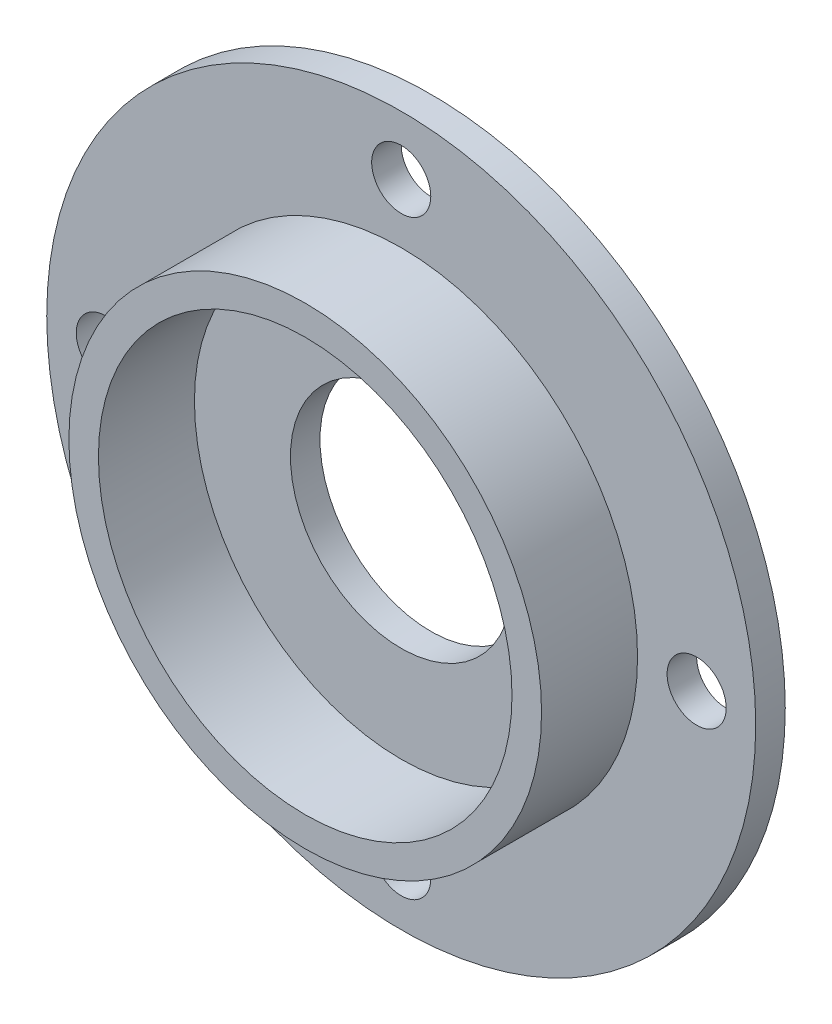
ISO-10303-21;
HEADER;
FILE_DESCRIPTION(('STEP AP214'),'2;1');
FILE_NAME('part.step','',(''),(''),'','','');
FILE_SCHEMA(('AUTOMOTIVE_DESIGN { 1 0 10303 214 1 1 1 1 }'));
ENDSEC;
DATA;
#1=APPLICATION_CONTEXT('core data for automotive mechanical design processes');
#2=APPLICATION_PROTOCOL_DEFINITION('international standard','automotive_design',2000,#1);
#3=PRODUCT_CONTEXT('',#1,'mechanical');
#4=PRODUCT('Part','Part','',(#3));
#5=PRODUCT_RELATED_PRODUCT_CATEGORY('part','',(#4));
#6=PRODUCT_DEFINITION_FORMATION('','',#4);
#7=PRODUCT_DEFINITION_CONTEXT('part definition',#1,'design');
#8=PRODUCT_DEFINITION('design','',#6,#7);
#9=PRODUCT_DEFINITION_SHAPE('','',#8);
#10=(LENGTH_UNIT() NAMED_UNIT(*) SI_UNIT(.MILLI.,.METRE.));
#11=(NAMED_UNIT(*) PLANE_ANGLE_UNIT() SI_UNIT($,.RADIAN.));
#12=(NAMED_UNIT(*) SI_UNIT($,.STERADIAN.) SOLID_ANGLE_UNIT());
#13=UNCERTAINTY_MEASURE_WITH_UNIT(LENGTH_MEASURE(1.E-05),#10,'distance_accuracy_value','');
#14=(GEOMETRIC_REPRESENTATION_CONTEXT(3) GLOBAL_UNCERTAINTY_ASSIGNED_CONTEXT((#13)) GLOBAL_UNIT_ASSIGNED_CONTEXT((#10,
#11,#12)) REPRESENTATION_CONTEXT('',''));
#15=CARTESIAN_POINT('',(0.,0.,0.));
#16=DIRECTION('',(0.,0.,1.));
#17=DIRECTION('',(1.,0.,0.));
#18=AXIS2_PLACEMENT_3D('',#15,#16,#17);
#19=CARTESIAN_POINT('',(0.,0.,10.));
#20=DIRECTION('',(0.,0.,1.));
#21=DIRECTION('',(1.,0.,0.));
#22=AXIS2_PLACEMENT_3D('',#19,#20,#21);
#23=PLANE('',#22);
#24=CARTESIAN_POINT('',(0.,-100.,10.));
#25=DIRECTION('',(0.,0.,1.));
#26=DIRECTION('',(1.,0.,0.));
#27=AXIS2_PLACEMENT_3D('',#24,#25,#26);
#28=CIRCLE('',#27,10.);
#29=CARTESIAN_POINT('',(10.,-100.,10.));
#30=VERTEX_POINT('',#29);
#31=EDGE_CURVE('E65',#30,#30,#28,.T.);
#32=ORIENTED_EDGE('',*,*,#31,.F.);
#33=EDGE_LOOP('',(#32));
#34=FACE_BOUND('',#33,.T.);
#35=CARTESIAN_POINT('',(0.,100.,10.));
#36=DIRECTION('',(0.,0.,1.));
#37=DIRECTION('',(1.,0.,0.));
#38=AXIS2_PLACEMENT_3D('',#35,#36,#37);
#39=CIRCLE('',#38,10.);
#40=CARTESIAN_POINT('',(10.,100.,10.));
#41=VERTEX_POINT('',#40);
#42=EDGE_CURVE('E53',#41,#41,#39,.T.);
#43=ORIENTED_EDGE('',*,*,#42,.F.);
#44=EDGE_LOOP('',(#43));
#45=FACE_BOUND('',#44,.T.);
#46=CARTESIAN_POINT('',(0.,0.,10.));
#47=DIRECTION('',(0.,0.,1.));
#48=DIRECTION('',(1.,0.,0.));
#49=AXIS2_PLACEMENT_3D('',#46,#47,#48);
#50=CIRCLE('',#49,120.);
#51=CARTESIAN_POINT('',(120.,0.,10.));
#52=VERTEX_POINT('',#51);
#53=EDGE_CURVE('E37',#52,#52,#50,.T.);
#54=ORIENTED_EDGE('',*,*,#53,.T.);
#55=EDGE_LOOP('',(#54));
#56=FACE_BOUND('',#55,.T.);
#57=CARTESIAN_POINT('',(100.,0.,10.));
#58=DIRECTION('',(0.,0.,1.));
#59=DIRECTION('',(1.,0.,0.));
#60=AXIS2_PLACEMENT_3D('',#57,#58,#59);
#61=CIRCLE('',#60,10.);
#62=CARTESIAN_POINT('',(110.,0.,10.));
#63=VERTEX_POINT('',#62);
#64=EDGE_CURVE('E59',#63,#63,#61,.T.);
#65=ORIENTED_EDGE('',*,*,#64,.F.);
#66=EDGE_LOOP('',(#65));
#67=FACE_BOUND('',#66,.T.);
#68=CARTESIAN_POINT('',(-100.,0.,10.));
#69=DIRECTION('',(0.,0.,1.));
#70=DIRECTION('',(1.,0.,0.));
#71=AXIS2_PLACEMENT_3D('',#68,#69,#70);
#72=CIRCLE('',#71,9.99999999999999);
#73=CARTESIAN_POINT('',(-90.,0.,10.));
#74=VERTEX_POINT('',#73);
#75=EDGE_CURVE('E71',#74,#74,#72,.T.);
#76=ORIENTED_EDGE('',*,*,#75,.F.);
#77=EDGE_LOOP('',(#76));
#78=FACE_BOUND('',#77,.T.);
#79=CARTESIAN_POINT('',(0.,0.,10.));
#80=DIRECTION('',(0.,0.,1.));
#81=DIRECTION('',(1.,0.,0.));
#82=AXIS2_PLACEMENT_3D('',#79,#80,#81);
#83=CIRCLE('',#82,80.);
#84=CARTESIAN_POINT('',(80.,0.,10.));
#85=VERTEX_POINT('',#84);
#86=EDGE_CURVE('E80',#85,#85,#83,.T.);
#87=ORIENTED_EDGE('',*,*,#86,.F.);
#88=EDGE_LOOP('',(#87));
#89=FACE_BOUND('',#88,.T.);
#90=ADVANCED_FACE('F30',(#34,#45,#56,#67,#78,#89),#23,.T.);
#91=CARTESIAN_POINT('',(0.,0.,10.));
#92=DIRECTION('',(0.,0.,1.));
#93=DIRECTION('',(1.,0.,0.));
#94=AXIS2_PLACEMENT_3D('',#91,#92,#93);
#95=CIRCLE('',#94,70.);
#96=CARTESIAN_POINT('',(70.,0.,10.));
#97=VERTEX_POINT('',#96);
#98=EDGE_CURVE('E10',#97,#97,#95,.F.);
#99=ORIENTED_EDGE('',*,*,#98,.F.);
#100=EDGE_LOOP('',(#99));
#101=FACE_BOUND('',#100,.T.);
#102=CARTESIAN_POINT('',(0.,0.,10.));
#103=DIRECTION('',(0.,0.,1.));
#104=DIRECTION('',(1.,0.,0.));
#105=AXIS2_PLACEMENT_3D('',#102,#103,#104);
#106=CIRCLE('',#105,37.5);
#107=CARTESIAN_POINT('',(37.5,0.,10.));
#108=VERTEX_POINT('',#107);
#109=EDGE_CURVE('E45',#108,#108,#106,.T.);
#110=ORIENTED_EDGE('',*,*,#109,.F.);
#111=EDGE_LOOP('',(#110));
#112=FACE_BOUND('',#111,.T.);
#113=ADVANCED_FACE('F106',(#101,#112),#23,.T.);
#114=CARTESIAN_POINT('',(0.,0.,0.));
#115=DIRECTION('',(0.,0.,1.));
#116=DIRECTION('',(1.,0.,0.));
#117=AXIS2_PLACEMENT_3D('',#114,#115,#116);
#118=PLANE('',#117);
#119=CARTESIAN_POINT('',(0.,-100.,0.));
#120=DIRECTION('',(0.,0.,1.));
#121=DIRECTION('',(1.,0.,0.));
#122=AXIS2_PLACEMENT_3D('',#119,#120,#121);
#123=CIRCLE('',#122,10.);
#124=CARTESIAN_POINT('',(10.,-100.,0.));
#125=VERTEX_POINT('',#124);
#126=EDGE_CURVE('E68',#125,#125,#123,.T.);
#127=ORIENTED_EDGE('',*,*,#126,.T.);
#128=EDGE_LOOP('',(#127));
#129=FACE_BOUND('',#128,.T.);
#130=CARTESIAN_POINT('',(0.,100.,0.));
#131=DIRECTION('',(0.,0.,1.));
#132=DIRECTION('',(1.,0.,0.));
#133=AXIS2_PLACEMENT_3D('',#130,#131,#132);
#134=CIRCLE('',#133,10.);
#135=CARTESIAN_POINT('',(10.,100.,0.));
#136=VERTEX_POINT('',#135);
#137=EDGE_CURVE('E56',#136,#136,#134,.T.);
#138=ORIENTED_EDGE('',*,*,#137,.T.);
#139=EDGE_LOOP('',(#138));
#140=FACE_BOUND('',#139,.T.);
#141=CARTESIAN_POINT('',(0.,0.,0.));
#142=DIRECTION('',(0.,0.,1.));
#143=DIRECTION('',(1.,0.,0.));
#144=AXIS2_PLACEMENT_3D('',#141,#142,#143);
#145=CIRCLE('',#144,120.);
#146=CARTESIAN_POINT('',(120.,0.,0.));
#147=VERTEX_POINT('',#146);
#148=EDGE_CURVE('E41',#147,#147,#145,.T.);
#149=ORIENTED_EDGE('',*,*,#148,.F.);
#150=EDGE_LOOP('',(#149));
#151=FACE_BOUND('',#150,.T.);
#152=CARTESIAN_POINT('',(0.,0.,0.));
#153=DIRECTION('',(0.,0.,1.));
#154=DIRECTION('',(1.,0.,0.));
#155=AXIS2_PLACEMENT_3D('',#152,#153,#154);
#156=CIRCLE('',#155,37.5);
#157=CARTESIAN_POINT('',(37.5,0.,0.));
#158=VERTEX_POINT('',#157);
#159=EDGE_CURVE('E50',#158,#158,#156,.T.);
#160=ORIENTED_EDGE('',*,*,#159,.T.);
#161=EDGE_LOOP('',(#160));
#162=FACE_BOUND('',#161,.T.);
#163=CARTESIAN_POINT('',(100.,0.,0.));
#164=DIRECTION('',(0.,0.,1.));
#165=DIRECTION('',(1.,0.,0.));
#166=AXIS2_PLACEMENT_3D('',#163,#164,#165);
#167=CIRCLE('',#166,10.);
#168=CARTESIAN_POINT('',(110.,0.,0.));
#169=VERTEX_POINT('',#168);
#170=EDGE_CURVE('E62',#169,#169,#167,.T.);
#171=ORIENTED_EDGE('',*,*,#170,.T.);
#172=EDGE_LOOP('',(#171));
#173=FACE_BOUND('',#172,.T.);
#174=CARTESIAN_POINT('',(-100.,0.,0.));
#175=DIRECTION('',(0.,0.,1.));
#176=DIRECTION('',(1.,0.,0.));
#177=AXIS2_PLACEMENT_3D('',#174,#175,#176);
#178=CIRCLE('',#177,9.99999999999999);
#179=CARTESIAN_POINT('',(-90.,0.,0.));
#180=VERTEX_POINT('',#179);
#181=EDGE_CURVE('E74',#180,#180,#178,.T.);
#182=ORIENTED_EDGE('',*,*,#181,.T.);
#183=EDGE_LOOP('',(#182));
#184=FACE_BOUND('',#183,.T.);
#185=ADVANCED_FACE('F111',(#129,#140,#151,#162,#173,#184),#118,.F.);
#186=CARTESIAN_POINT('',(0.,0.,10.));
#187=DIRECTION('',(0.,0.,-1.));
#188=DIRECTION('',(-1.,0.,0.));
#189=AXIS2_PLACEMENT_3D('',#186,#187,#188);
#190=CYLINDRICAL_SURFACE('',#189,120.);
#191=ORIENTED_EDGE('',*,*,#53,.F.);
#192=EDGE_LOOP('',(#191));
#193=FACE_BOUND('',#192,.T.);
#194=ORIENTED_EDGE('',*,*,#148,.T.);
#195=EDGE_LOOP('',(#194));
#196=FACE_BOUND('',#195,.T.);
#197=ADVANCED_FACE('F32',(#193,#196),#190,.T.);
#198=CARTESIAN_POINT('',(0.,0.,10.));
#199=DIRECTION('',(0.,0.,-1.));
#200=DIRECTION('',(-1.,0.,0.));
#201=AXIS2_PLACEMENT_3D('',#198,#199,#200);
#202=CYLINDRICAL_SURFACE('',#201,37.5);
#203=ORIENTED_EDGE('',*,*,#109,.T.);
#204=EDGE_LOOP('',(#203));
#205=FACE_BOUND('',#204,.T.);
#206=ORIENTED_EDGE('',*,*,#159,.F.);
#207=EDGE_LOOP('',(#206));
#208=FACE_BOUND('',#207,.T.);
#209=ADVANCED_FACE('F119',(#205,#208),#202,.F.);
#210=CARTESIAN_POINT('',(0.,100.,10.));
#211=DIRECTION('',(0.,0.,-1.));
#212=DIRECTION('',(-1.,0.,0.));
#213=AXIS2_PLACEMENT_3D('',#210,#211,#212);
#214=CYLINDRICAL_SURFACE('',#213,10.);
#215=ORIENTED_EDGE('',*,*,#42,.T.);
#216=EDGE_LOOP('',(#215));
#217=FACE_BOUND('',#216,.T.);
#218=ORIENTED_EDGE('',*,*,#137,.F.);
#219=EDGE_LOOP('',(#218));
#220=FACE_BOUND('',#219,.T.);
#221=ADVANCED_FACE('F122',(#217,#220),#214,.F.);
#222=CARTESIAN_POINT('',(100.,0.,10.));
#223=DIRECTION('',(0.,0.,-1.));
#224=DIRECTION('',(-1.,0.,0.));
#225=AXIS2_PLACEMENT_3D('',#222,#223,#224);
#226=CYLINDRICAL_SURFACE('',#225,10.);
#227=ORIENTED_EDGE('',*,*,#64,.T.);
#228=EDGE_LOOP('',(#227));
#229=FACE_BOUND('',#228,.T.);
#230=ORIENTED_EDGE('',*,*,#170,.F.);
#231=EDGE_LOOP('',(#230));
#232=FACE_BOUND('',#231,.T.);
#233=ADVANCED_FACE('F126',(#229,#232),#226,.F.);
#234=CARTESIAN_POINT('',(0.,-100.,10.));
#235=DIRECTION('',(0.,0.,-1.));
#236=DIRECTION('',(-1.,0.,0.));
#237=AXIS2_PLACEMENT_3D('',#234,#235,#236);
#238=CYLINDRICAL_SURFACE('',#237,10.);
#239=ORIENTED_EDGE('',*,*,#31,.T.);
#240=EDGE_LOOP('',(#239));
#241=FACE_BOUND('',#240,.T.);
#242=ORIENTED_EDGE('',*,*,#126,.F.);
#243=EDGE_LOOP('',(#242));
#244=FACE_BOUND('',#243,.T.);
#245=ADVANCED_FACE('F101',(#241,#244),#238,.F.);
#246=CARTESIAN_POINT('',(-100.,0.,10.));
#247=DIRECTION('',(0.,0.,-1.));
#248=DIRECTION('',(-1.,0.,0.));
#249=AXIS2_PLACEMENT_3D('',#246,#247,#248);
#250=CYLINDRICAL_SURFACE('',#249,9.99999999999999);
#251=ORIENTED_EDGE('',*,*,#75,.T.);
#252=EDGE_LOOP('',(#251));
#253=FACE_BOUND('',#252,.T.);
#254=ORIENTED_EDGE('',*,*,#181,.F.);
#255=EDGE_LOOP('',(#254));
#256=FACE_BOUND('',#255,.T.);
#257=ADVANCED_FACE('F92',(#253,#256),#250,.F.);
#258=CARTESIAN_POINT('',(0.,0.,42.5));
#259=DIRECTION('',(0.,0.,1.));
#260=DIRECTION('',(1.,0.,0.));
#261=AXIS2_PLACEMENT_3D('',#258,#259,#260);
#262=PLANE('',#261);
#263=CARTESIAN_POINT('',(0.,0.,42.5));
#264=DIRECTION('',(0.,0.,1.));
#265=DIRECTION('',(1.,0.,0.));
#266=AXIS2_PLACEMENT_3D('',#263,#264,#265);
#267=CIRCLE('',#266,80.);
#268=CARTESIAN_POINT('',(80.,0.,42.5));
#269=VERTEX_POINT('',#268);
#270=EDGE_CURVE('E77',#269,#269,#267,.T.);
#271=ORIENTED_EDGE('',*,*,#270,.T.);
#272=EDGE_LOOP('',(#271));
#273=FACE_BOUND('',#272,.T.);
#274=CARTESIAN_POINT('',(0.,0.,42.5));
#275=DIRECTION('',(0.,0.,1.));
#276=DIRECTION('',(1.,0.,0.));
#277=AXIS2_PLACEMENT_3D('',#274,#275,#276);
#278=CIRCLE('',#277,70.);
#279=CARTESIAN_POINT('',(70.,0.,42.5));
#280=VERTEX_POINT('',#279);
#281=EDGE_CURVE('E83',#280,#280,#278,.T.);
#282=ORIENTED_EDGE('',*,*,#281,.F.);
#283=EDGE_LOOP('',(#282));
#284=FACE_BOUND('',#283,.T.);
#285=ADVANCED_FACE('F89',(#273,#284),#262,.T.);
#286=CARTESIAN_POINT('',(0.,0.,42.5));
#287=DIRECTION('',(0.,0.,-1.));
#288=DIRECTION('',(-1.,0.,0.));
#289=AXIS2_PLACEMENT_3D('',#286,#287,#288);
#290=CYLINDRICAL_SURFACE('',#289,80.);
#291=ORIENTED_EDGE('',*,*,#270,.F.);
#292=EDGE_LOOP('',(#291));
#293=FACE_BOUND('',#292,.T.);
#294=ORIENTED_EDGE('',*,*,#86,.T.);
#295=EDGE_LOOP('',(#294));
#296=FACE_BOUND('',#295,.T.);
#297=ADVANCED_FACE('F91',(#293,#296),#290,.T.);
#298=CARTESIAN_POINT('',(0.,0.,42.5));
#299=DIRECTION('',(0.,0.,-1.));
#300=DIRECTION('',(-1.,0.,0.));
#301=AXIS2_PLACEMENT_3D('',#298,#299,#300);
#302=CYLINDRICAL_SURFACE('',#301,70.);
#303=ORIENTED_EDGE('',*,*,#281,.T.);
#304=EDGE_LOOP('',(#303));
#305=FACE_BOUND('',#304,.T.);
#306=ORIENTED_EDGE('',*,*,#98,.T.);
#307=EDGE_LOOP('',(#306));
#308=FACE_BOUND('',#307,.T.);
#309=ADVANCED_FACE('F87',(#305,#308),#302,.F.);
#310=CLOSED_SHELL('',(#90,#113,#185,#197,#209,#221,#233,#245,#257,#285,#297,#309));
#311=MANIFOLD_SOLID_BREP('B2',#310);
#312=ADVANCED_BREP_SHAPE_REPRESENTATION('',(#18,#311),#14);
#313=SHAPE_DEFINITION_REPRESENTATION(#9,#312);
ENDSEC;
END-ISO-10303-21;
